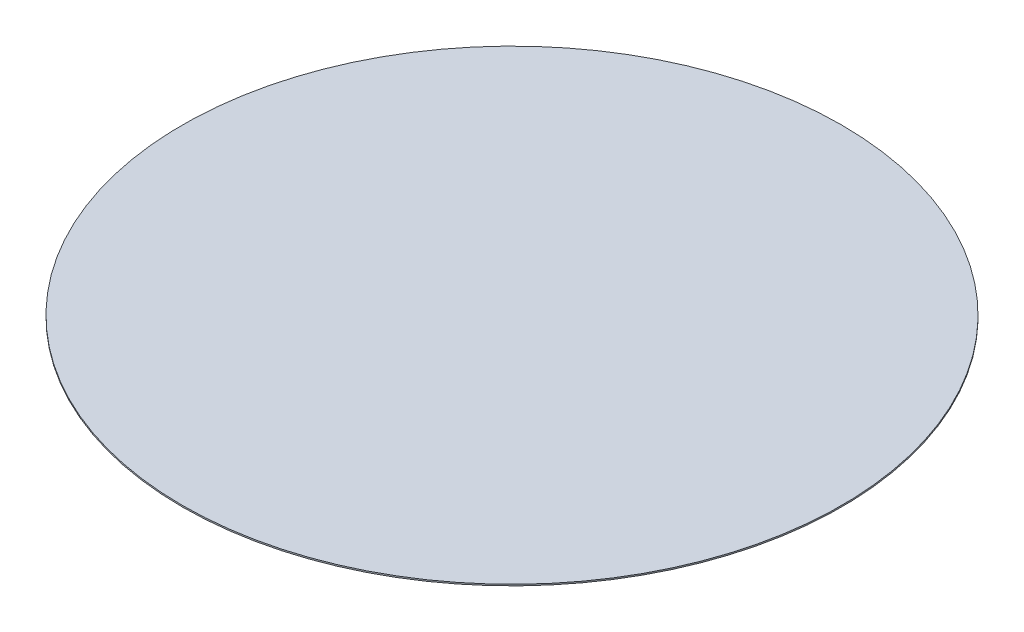
ISO-10303-21;
HEADER;
FILE_DESCRIPTION(('STEP AP214'),'2;1');
FILE_NAME('part.step','',(''),(''),'','','');
FILE_SCHEMA(('AUTOMOTIVE_DESIGN { 1 0 10303 214 1 1 1 1 }'));
ENDSEC;
DATA;
#1=APPLICATION_CONTEXT('core data for automotive mechanical design processes');
#2=APPLICATION_PROTOCOL_DEFINITION('international standard','automotive_design',2000,#1);
#3=PRODUCT_CONTEXT('',#1,'mechanical');
#4=PRODUCT('Part','Part','',(#3));
#5=PRODUCT_RELATED_PRODUCT_CATEGORY('part','',(#4));
#6=PRODUCT_DEFINITION_FORMATION('','',#4);
#7=PRODUCT_DEFINITION_CONTEXT('part definition',#1,'design');
#8=PRODUCT_DEFINITION('design','',#6,#7);
#9=PRODUCT_DEFINITION_SHAPE('','',#8);
#10=(LENGTH_UNIT() NAMED_UNIT(*) SI_UNIT(.MILLI.,.METRE.));
#11=(NAMED_UNIT(*) PLANE_ANGLE_UNIT() SI_UNIT($,.RADIAN.));
#12=(NAMED_UNIT(*) SI_UNIT($,.STERADIAN.) SOLID_ANGLE_UNIT());
#13=UNCERTAINTY_MEASURE_WITH_UNIT(LENGTH_MEASURE(1.E-05),#10,'distance_accuracy_value','');
#14=(GEOMETRIC_REPRESENTATION_CONTEXT(3) GLOBAL_UNCERTAINTY_ASSIGNED_CONTEXT((#13)) GLOBAL_UNIT_ASSIGNED_CONTEXT((#10,
#11,#12)) REPRESENTATION_CONTEXT('',''));
#15=CARTESIAN_POINT('',(0.,0.,0.));
#16=DIRECTION('',(0.,0.,1.));
#17=DIRECTION('',(1.,0.,0.));
#18=AXIS2_PLACEMENT_3D('',#15,#16,#17);
#19=CARTESIAN_POINT('',(0.,0.6,0.));
#20=DIRECTION('',(0.,-1.,0.));
#21=DIRECTION('',(0.,0.,-1.));
#22=AXIS2_PLACEMENT_3D('',#19,#20,#21);
#23=CYLINDRICAL_SURFACE('',#22,140.);
#24=CARTESIAN_POINT('',(0.,0.6,0.));
#25=DIRECTION('',(0.,1.,0.));
#26=DIRECTION('',(0.,0.,1.));
#27=AXIS2_PLACEMENT_3D('',#24,#25,#26);
#28=CIRCLE('',#27,140.);
#29=CARTESIAN_POINT('',(0.,0.6,140.));
#30=VERTEX_POINT('',#29);
#31=EDGE_CURVE('E10',#30,#30,#28,.T.);
#32=ORIENTED_EDGE('',*,*,#31,.F.);
#33=EDGE_LOOP('',(#32));
#34=FACE_BOUND('',#33,.T.);
#35=CARTESIAN_POINT('',(0.,0.,0.));
#36=DIRECTION('',(0.,1.,0.));
#37=DIRECTION('',(0.,0.,1.));
#38=AXIS2_PLACEMENT_3D('',#35,#36,#37);
#39=CIRCLE('',#38,140.);
#40=CARTESIAN_POINT('',(0.,0.,140.));
#41=VERTEX_POINT('',#40);
#42=EDGE_CURVE('E36',#41,#41,#39,.T.);
#43=ORIENTED_EDGE('',*,*,#42,.T.);
#44=EDGE_LOOP('',(#43));
#45=FACE_BOUND('',#44,.T.);
#46=ADVANCED_FACE('F33',(#34,#45),#23,.T.);
#47=CARTESIAN_POINT('',(0.,0.6,0.));
#48=DIRECTION('',(0.,1.,0.));
#49=DIRECTION('',(0.,0.,1.));
#50=AXIS2_PLACEMENT_3D('',#47,#48,#49);
#51=PLANE('',#50);
#52=ORIENTED_EDGE('',*,*,#31,.T.);
#53=EDGE_LOOP('',(#52));
#54=FACE_BOUND('',#53,.T.);
#55=ADVANCED_FACE('F48',(#54),#51,.T.);
#56=CARTESIAN_POINT('',(0.,0.,0.));
#57=DIRECTION('',(0.,1.,0.));
#58=DIRECTION('',(0.,0.,1.));
#59=AXIS2_PLACEMENT_3D('',#56,#57,#58);
#60=PLANE('',#59);
#61=ORIENTED_EDGE('',*,*,#42,.F.);
#62=EDGE_LOOP('',(#61));
#63=FACE_BOUND('',#62,.T.);
#64=ADVANCED_FACE('F46',(#63),#60,.F.);
#65=CLOSED_SHELL('',(#46,#55,#64));
#66=MANIFOLD_SOLID_BREP('B2',#65);
#67=ADVANCED_BREP_SHAPE_REPRESENTATION('',(#18,#66),#14);
#68=SHAPE_DEFINITION_REPRESENTATION(#9,#67);
ENDSEC;
END-ISO-10303-21;
